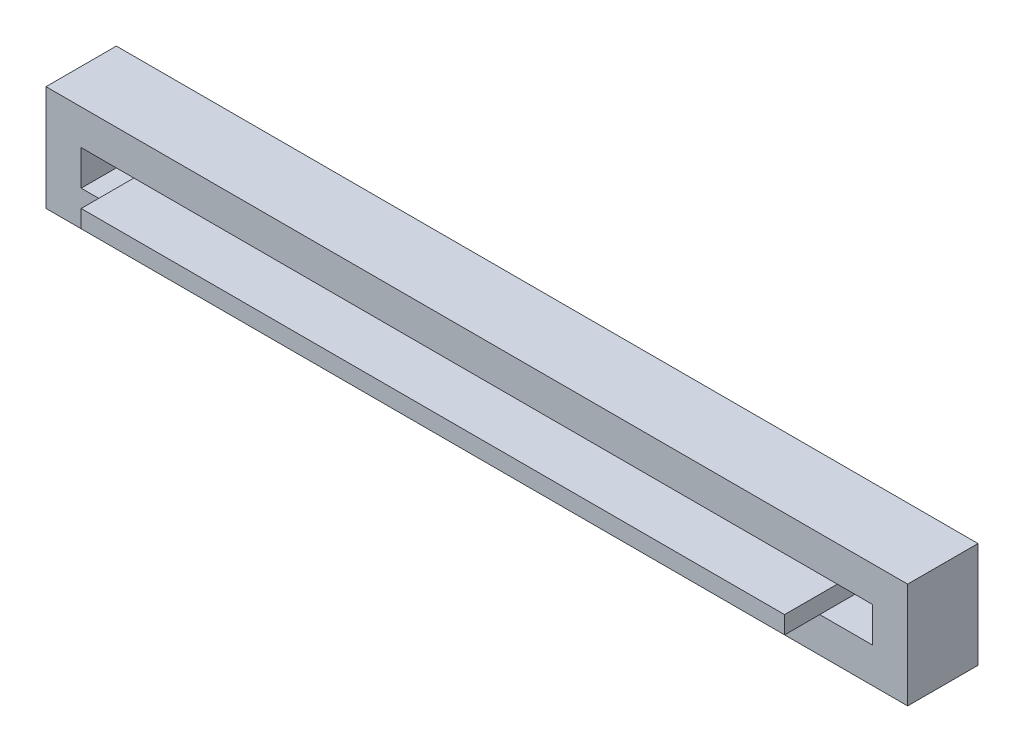
ISO-10303-21;
HEADER;
FILE_DESCRIPTION(('STEP AP214'),'2;1');
FILE_NAME('part.step','',(''),(''),'','','');
FILE_SCHEMA(('AUTOMOTIVE_DESIGN { 1 0 10303 214 1 1 1 1 }'));
ENDSEC;
DATA;
#1=APPLICATION_CONTEXT('core data for automotive mechanical design processes');
#2=APPLICATION_PROTOCOL_DEFINITION('international standard','automotive_design',2000,#1);
#3=PRODUCT_CONTEXT('',#1,'mechanical');
#4=PRODUCT('Part','Part','',(#3));
#5=PRODUCT_RELATED_PRODUCT_CATEGORY('part','',(#4));
#6=PRODUCT_DEFINITION_FORMATION('','',#4);
#7=PRODUCT_DEFINITION_CONTEXT('part definition',#1,'design');
#8=PRODUCT_DEFINITION('design','',#6,#7);
#9=PRODUCT_DEFINITION_SHAPE('','',#8);
#10=(LENGTH_UNIT() NAMED_UNIT(*) SI_UNIT(.MILLI.,.METRE.));
#11=(NAMED_UNIT(*) PLANE_ANGLE_UNIT() SI_UNIT($,.RADIAN.));
#12=(NAMED_UNIT(*) SI_UNIT($,.STERADIAN.) SOLID_ANGLE_UNIT());
#13=UNCERTAINTY_MEASURE_WITH_UNIT(LENGTH_MEASURE(1.E-05),#10,'distance_accuracy_value','');
#14=(GEOMETRIC_REPRESENTATION_CONTEXT(3) GLOBAL_UNCERTAINTY_ASSIGNED_CONTEXT((#13)) GLOBAL_UNIT_ASSIGNED_CONTEXT((#10,
#11,#12)) REPRESENTATION_CONTEXT('',''));
#15=CARTESIAN_POINT('',(0.,0.,0.));
#16=DIRECTION('',(0.,0.,1.));
#17=DIRECTION('',(1.,0.,0.));
#18=AXIS2_PLACEMENT_3D('',#15,#16,#17);
#19=CARTESIAN_POINT('',(0.,0.,2.));
#20=DIRECTION('',(0.,0.,1.));
#21=DIRECTION('',(1.,0.,0.));
#22=AXIS2_PLACEMENT_3D('',#19,#20,#21);
#23=PLANE('',#22);
#24=DIRECTION('',(0.,-1.,0.));
#25=VECTOR('',#24,1.);
#26=CARTESIAN_POINT('',(22.5,0.,2.));
#27=LINE('',#26,#25);
#28=CARTESIAN_POINT('',(22.5,0.999999999999999,2.));
#29=VERTEX_POINT('',#28);
#30=CARTESIAN_POINT('',(22.5,-0.999999999999999,2.));
#31=VERTEX_POINT('',#30);
#32=EDGE_CURVE('E239',#29,#31,#27,.T.);
#33=ORIENTED_EDGE('',*,*,#32,.F.);
#34=DIRECTION('',(1.,0.,0.));
#35=VECTOR('',#34,1.);
#36=CARTESIAN_POINT('',(0.,0.999999999999999,2.));
#37=LINE('',#36,#35);
#38=CARTESIAN_POINT('',(-22.5,0.999999999999999,2.));
#39=VERTEX_POINT('',#38);
#40=EDGE_CURVE('E242',#39,#29,#37,.T.);
#41=ORIENTED_EDGE('',*,*,#40,.F.);
#42=DIRECTION('',(0.,-1.,0.));
#43=VECTOR('',#42,1.);
#44=CARTESIAN_POINT('',(-22.5,0.,2.));
#45=LINE('',#44,#43);
#46=CARTESIAN_POINT('',(-22.5,-0.999999999999999,2.));
#47=VERTEX_POINT('',#46);
#48=EDGE_CURVE('E56',#39,#47,#45,.T.);
#49=ORIENTED_EDGE('',*,*,#48,.T.);
#50=DIRECTION('',(1.,0.,0.));
#51=VECTOR('',#50,1.);
#52=CARTESIAN_POINT('',(0.,-0.999999999999999,2.));
#53=LINE('',#52,#51);
#54=EDGE_CURVE('E11',#47,#31,#53,.T.);
#55=ORIENTED_EDGE('',*,*,#54,.T.);
#56=EDGE_LOOP('',(#33,#41,#49,#55));
#57=FACE_BOUND('',#56,.T.);
#58=DIRECTION('',(-1.,0.,0.));
#59=VECTOR('',#58,1.);
#60=CARTESIAN_POINT('',(-20.,0.5,2.));
#61=LINE('',#60,#59);
#62=CARTESIAN_POINT('',(20.,0.5,2.));
#63=VERTEX_POINT('',#62);
#64=CARTESIAN_POINT('',(-20.,0.5,2.));
#65=VERTEX_POINT('',#64);
#66=EDGE_CURVE('E425',#63,#65,#61,.T.);
#67=ORIENTED_EDGE('',*,*,#66,.F.);
#68=DIRECTION('',(0.,1.,0.));
#69=VECTOR('',#68,1.);
#70=CARTESIAN_POINT('',(20.,0.5,2.));
#71=LINE('',#70,#69);
#72=CARTESIAN_POINT('',(20.,-0.5,2.));
#73=VERTEX_POINT('',#72);
#74=EDGE_CURVE('E162',#73,#63,#71,.T.);
#75=ORIENTED_EDGE('',*,*,#74,.F.);
#76=DIRECTION('',(1.,0.,0.));
#77=VECTOR('',#76,1.);
#78=CARTESIAN_POINT('',(-20.,-0.5,2.));
#79=LINE('',#78,#77);
#80=CARTESIAN_POINT('',(-20.,-0.5,2.));
#81=VERTEX_POINT('',#80);
#82=EDGE_CURVE('E158',#81,#73,#79,.T.);
#83=ORIENTED_EDGE('',*,*,#82,.F.);
#84=DIRECTION('',(0.,-1.,0.));
#85=VECTOR('',#84,1.);
#86=CARTESIAN_POINT('',(-20.,0.5,2.));
#87=LINE('',#86,#85);
#88=EDGE_CURVE('E421',#65,#81,#87,.T.);
#89=ORIENTED_EDGE('',*,*,#88,.F.);
#90=EDGE_LOOP('',(#67,#75,#83,#89));
#91=FACE_BOUND('',#90,.T.);
#92=ADVANCED_FACE('F47',(#57,#91),#23,.T.);
#93=CARTESIAN_POINT('',(0.,0.,4.));
#94=DIRECTION('',(0.,0.,1.));
#95=DIRECTION('',(1.,0.,0.));
#96=AXIS2_PLACEMENT_3D('',#93,#94,#95);
#97=PLANE('',#96);
#98=DIRECTION('',(0.,1.,0.));
#99=VECTOR('',#98,1.);
#100=CARTESIAN_POINT('',(24.5,3.,4.));
#101=LINE('',#100,#99);
#102=CARTESIAN_POINT('',(24.5,-3.,4.));
#103=VERTEX_POINT('',#102);
#104=CARTESIAN_POINT('',(24.5,3.,4.));
#105=VERTEX_POINT('',#104);
#106=EDGE_CURVE('E198',#103,#105,#101,.T.);
#107=ORIENTED_EDGE('',*,*,#106,.T.);
#108=DIRECTION('',(-1.,0.,0.));
#109=VECTOR('',#108,1.);
#110=CARTESIAN_POINT('',(-24.5,3.,4.));
#111=LINE('',#110,#109);
#112=CARTESIAN_POINT('',(-24.5,3.,4.));
#113=VERTEX_POINT('',#112);
#114=EDGE_CURVE('E202',#105,#113,#111,.T.);
#115=ORIENTED_EDGE('',*,*,#114,.T.);
#116=DIRECTION('',(0.,-1.,0.));
#117=VECTOR('',#116,1.);
#118=CARTESIAN_POINT('',(-24.5,3.,4.));
#119=LINE('',#118,#117);
#120=CARTESIAN_POINT('',(-24.5,-3.,4.));
#121=VERTEX_POINT('',#120);
#122=EDGE_CURVE('E206',#113,#121,#119,.T.);
#123=ORIENTED_EDGE('',*,*,#122,.T.);
#124=DIRECTION('',(1.,0.,0.));
#125=VECTOR('',#124,1.);
#126=CARTESIAN_POINT('',(-24.5,-3.,4.));
#127=LINE('',#126,#125);
#128=EDGE_CURVE('E209',#121,#103,#127,.T.);
#129=ORIENTED_EDGE('',*,*,#128,.T.);
#130=EDGE_LOOP('',(#107,#115,#123,#129));
#131=FACE_BOUND('',#130,.T.);
#132=DIRECTION('',(-1.,0.,0.));
#133=VECTOR('',#132,1.);
#134=CARTESIAN_POINT('',(-22.5,0.999999999999999,4.));
#135=LINE('',#134,#133);
#136=CARTESIAN_POINT('',(22.5,0.999999999999999,4.));
#137=VERTEX_POINT('',#136);
#138=CARTESIAN_POINT('',(-22.5,0.999999999999999,4.));
#139=VERTEX_POINT('',#138);
#140=EDGE_CURVE('E169',#137,#139,#135,.T.);
#141=ORIENTED_EDGE('',*,*,#140,.F.);
#142=DIRECTION('',(0.,1.,0.));
#143=VECTOR('',#142,1.);
#144=CARTESIAN_POINT('',(22.5,0.999999999999999,4.));
#145=LINE('',#144,#143);
#146=CARTESIAN_POINT('',(22.5,-0.999999999999999,4.));
#147=VERTEX_POINT('',#146);
#148=EDGE_CURVE('E165',#147,#137,#145,.T.);
#149=ORIENTED_EDGE('',*,*,#148,.F.);
#150=DIRECTION('',(1.,0.,0.));
#151=VECTOR('',#150,1.);
#152=CARTESIAN_POINT('',(-22.5,-0.999999999999999,4.));
#153=LINE('',#152,#151);
#154=CARTESIAN_POINT('',(-22.5,-0.999999999999999,4.));
#155=VERTEX_POINT('',#154);
#156=EDGE_CURVE('E180',#155,#147,#153,.T.);
#157=ORIENTED_EDGE('',*,*,#156,.F.);
#158=DIRECTION('',(0.,-1.,0.));
#159=VECTOR('',#158,1.);
#160=CARTESIAN_POINT('',(-22.5,0.999999999999999,4.));
#161=LINE('',#160,#159);
#162=EDGE_CURVE('E176',#139,#155,#161,.T.);
#163=ORIENTED_EDGE('',*,*,#162,.F.);
#164=EDGE_LOOP('',(#141,#149,#157,#163));
#165=FACE_BOUND('',#164,.T.);
#166=ADVANCED_FACE('F260',(#131,#165),#97,.T.);
#167=CARTESIAN_POINT('',(24.5,3.,4.));
#168=DIRECTION('',(-1.,0.,0.));
#169=DIRECTION('',(0.,0.,1.));
#170=AXIS2_PLACEMENT_3D('',#167,#168,#169);
#171=PLANE('',#170);
#172=DIRECTION('',(0.,1.,0.));
#173=VECTOR('',#172,1.);
#174=CARTESIAN_POINT('',(24.5,3.,0.));
#175=LINE('',#174,#173);
#176=CARTESIAN_POINT('',(24.5,-3.,0.));
#177=VERTEX_POINT('',#176);
#178=CARTESIAN_POINT('',(24.5,3.,0.));
#179=VERTEX_POINT('',#178);
#180=EDGE_CURVE('E197',#177,#179,#175,.T.);
#181=ORIENTED_EDGE('',*,*,#180,.T.);
#182=DIRECTION('',(0.,0.,-1.));
#183=VECTOR('',#182,1.);
#184=CARTESIAN_POINT('',(24.5,3.,4.));
#185=LINE('',#184,#183);
#186=EDGE_CURVE('E235',#105,#179,#185,.T.);
#187=ORIENTED_EDGE('',*,*,#186,.F.);
#188=ORIENTED_EDGE('',*,*,#106,.F.);
#189=DIRECTION('',(0.,0.,-1.));
#190=VECTOR('',#189,1.);
#191=CARTESIAN_POINT('',(24.5,-3.,4.));
#192=LINE('',#191,#190);
#193=EDGE_CURVE('E212',#103,#177,#192,.T.);
#194=ORIENTED_EDGE('',*,*,#193,.T.);
#195=EDGE_LOOP('',(#181,#187,#188,#194));
#196=FACE_BOUND('',#195,.T.);
#197=ADVANCED_FACE('F283',(#196),#171,.F.);
#198=CARTESIAN_POINT('',(-24.5,3.,4.));
#199=DIRECTION('',(0.,-1.,0.));
#200=DIRECTION('',(0.,0.,-1.));
#201=AXIS2_PLACEMENT_3D('',#198,#199,#200);
#202=PLANE('',#201);
#203=DIRECTION('',(-1.,0.,0.));
#204=VECTOR('',#203,1.);
#205=CARTESIAN_POINT('',(-24.5,3.,0.));
#206=LINE('',#205,#204);
#207=CARTESIAN_POINT('',(-24.5,3.,0.));
#208=VERTEX_POINT('',#207);
#209=EDGE_CURVE('E216',#179,#208,#206,.T.);
#210=ORIENTED_EDGE('',*,*,#209,.T.);
#211=DIRECTION('',(0.,0.,-1.));
#212=VECTOR('',#211,1.);
#213=CARTESIAN_POINT('',(-24.5,3.,4.));
#214=LINE('',#213,#212);
#215=EDGE_CURVE('E231',#113,#208,#214,.T.);
#216=ORIENTED_EDGE('',*,*,#215,.F.);
#217=ORIENTED_EDGE('',*,*,#114,.F.);
#218=ORIENTED_EDGE('',*,*,#186,.T.);
#219=EDGE_LOOP('',(#210,#216,#217,#218));
#220=FACE_BOUND('',#219,.T.);
#221=ADVANCED_FACE('F288',(#220),#202,.F.);
#222=CARTESIAN_POINT('',(-24.5,3.,4.));
#223=DIRECTION('',(1.,0.,0.));
#224=DIRECTION('',(0.,0.,-1.));
#225=AXIS2_PLACEMENT_3D('',#222,#223,#224);
#226=PLANE('',#225);
#227=DIRECTION('',(0.,-1.,0.));
#228=VECTOR('',#227,1.);
#229=CARTESIAN_POINT('',(-24.5,3.,0.));
#230=LINE('',#229,#228);
#231=CARTESIAN_POINT('',(-24.5,-3.,0.));
#232=VERTEX_POINT('',#231);
#233=EDGE_CURVE('E219',#208,#232,#230,.T.);
#234=ORIENTED_EDGE('',*,*,#233,.T.);
#235=DIRECTION('',(0.,0.,-1.));
#236=VECTOR('',#235,1.);
#237=CARTESIAN_POINT('',(-24.5,-3.,4.));
#238=LINE('',#237,#236);
#239=EDGE_CURVE('E227',#121,#232,#238,.T.);
#240=ORIENTED_EDGE('',*,*,#239,.F.);
#241=ORIENTED_EDGE('',*,*,#122,.F.);
#242=ORIENTED_EDGE('',*,*,#215,.T.);
#243=EDGE_LOOP('',(#234,#240,#241,#242));
#244=FACE_BOUND('',#243,.T.);
#245=ADVANCED_FACE('F273',(#244),#226,.F.);
#246=CARTESIAN_POINT('',(-24.5,-3.,4.));
#247=DIRECTION('',(0.,1.,0.));
#248=DIRECTION('',(0.,0.,1.));
#249=AXIS2_PLACEMENT_3D('',#246,#247,#248);
#250=PLANE('',#249);
#251=DIRECTION('',(1.,0.,0.));
#252=VECTOR('',#251,1.);
#253=CARTESIAN_POINT('',(-24.5,-3.,0.));
#254=LINE('',#253,#252);
#255=EDGE_CURVE('E203',#232,#177,#254,.T.);
#256=ORIENTED_EDGE('',*,*,#255,.T.);
#257=ORIENTED_EDGE('',*,*,#193,.F.);
#258=ORIENTED_EDGE('',*,*,#128,.F.);
#259=ORIENTED_EDGE('',*,*,#239,.T.);
#260=EDGE_LOOP('',(#256,#257,#258,#259));
#261=FACE_BOUND('',#260,.T.);
#262=ADVANCED_FACE('F266',(#261),#250,.F.);
#263=CARTESIAN_POINT('',(22.5,0.999999999999999,4.));
#264=DIRECTION('',(-1.,0.,0.));
#265=DIRECTION('',(0.,-1.,0.));
#266=AXIS2_PLACEMENT_3D('',#263,#264,#265);
#267=PLANE('',#266);
#268=DIRECTION('',(0.,0.,-1.));
#269=VECTOR('',#268,1.);
#270=CARTESIAN_POINT('',(22.5,0.999999999999999,4.));
#271=LINE('',#270,#269);
#272=EDGE_CURVE('E193',#137,#29,#271,.T.);
#273=ORIENTED_EDGE('',*,*,#272,.T.);
#274=ORIENTED_EDGE('',*,*,#32,.T.);
#275=DIRECTION('',(0.,0.,-1.));
#276=VECTOR('',#275,1.);
#277=CARTESIAN_POINT('',(22.5,-0.999999999999999,4.));
#278=LINE('',#277,#276);
#279=EDGE_CURVE('E71',#147,#31,#278,.T.);
#280=ORIENTED_EDGE('',*,*,#279,.F.);
#281=ORIENTED_EDGE('',*,*,#148,.T.);
#282=EDGE_LOOP('',(#273,#274,#280,#281));
#283=FACE_BOUND('',#282,.T.);
#284=ADVANCED_FACE('F264',(#283),#267,.T.);
#285=CARTESIAN_POINT('',(-22.5,0.999999999999999,4.));
#286=DIRECTION('',(0.,-1.,0.));
#287=DIRECTION('',(0.,0.,-1.));
#288=AXIS2_PLACEMENT_3D('',#285,#286,#287);
#289=PLANE('',#288);
#290=DIRECTION('',(0.,0.,-1.));
#291=VECTOR('',#290,1.);
#292=CARTESIAN_POINT('',(-22.5,0.999999999999999,4.));
#293=LINE('',#292,#291);
#294=EDGE_CURVE('E189',#139,#39,#293,.T.);
#295=ORIENTED_EDGE('',*,*,#294,.T.);
#296=ORIENTED_EDGE('',*,*,#40,.T.);
#297=ORIENTED_EDGE('',*,*,#272,.F.);
#298=ORIENTED_EDGE('',*,*,#140,.T.);
#299=EDGE_LOOP('',(#295,#296,#297,#298));
#300=FACE_BOUND('',#299,.T.);
#301=ADVANCED_FACE('F255',(#300),#289,.T.);
#302=CARTESIAN_POINT('',(-22.5,0.999999999999999,4.));
#303=DIRECTION('',(1.,0.,0.));
#304=DIRECTION('',(0.,0.,-1.));
#305=AXIS2_PLACEMENT_3D('',#302,#303,#304);
#306=PLANE('',#305);
#307=DIRECTION('',(0.,0.,-1.));
#308=VECTOR('',#307,1.);
#309=CARTESIAN_POINT('',(-22.5,-0.999999999999999,4.));
#310=LINE('',#309,#308);
#311=EDGE_CURVE('E185',#155,#47,#310,.T.);
#312=ORIENTED_EDGE('',*,*,#311,.T.);
#313=ORIENTED_EDGE('',*,*,#48,.F.);
#314=ORIENTED_EDGE('',*,*,#294,.F.);
#315=ORIENTED_EDGE('',*,*,#162,.T.);
#316=EDGE_LOOP('',(#312,#313,#314,#315));
#317=FACE_BOUND('',#316,.T.);
#318=ADVANCED_FACE('F252',(#317),#306,.T.);
#319=CARTESIAN_POINT('',(-22.5,-0.999999999999999,4.));
#320=DIRECTION('',(0.,1.,0.));
#321=DIRECTION('',(0.,0.,1.));
#322=AXIS2_PLACEMENT_3D('',#319,#320,#321);
#323=PLANE('',#322);
#324=ORIENTED_EDGE('',*,*,#279,.T.);
#325=ORIENTED_EDGE('',*,*,#54,.F.);
#326=ORIENTED_EDGE('',*,*,#311,.F.);
#327=ORIENTED_EDGE('',*,*,#156,.T.);
#328=EDGE_LOOP('',(#324,#325,#326,#327));
#329=FACE_BOUND('',#328,.T.);
#330=ADVANCED_FACE('F262',(#329),#323,.T.);
#331=CARTESIAN_POINT('',(0.,0.,0.));
#332=DIRECTION('',(0.,0.,1.));
#333=DIRECTION('',(1.,0.,0.));
#334=AXIS2_PLACEMENT_3D('',#331,#332,#333);
#335=PLANE('',#334);
#336=ORIENTED_EDGE('',*,*,#180,.F.);
#337=ORIENTED_EDGE('',*,*,#255,.F.);
#338=ORIENTED_EDGE('',*,*,#233,.F.);
#339=ORIENTED_EDGE('',*,*,#209,.F.);
#340=EDGE_LOOP('',(#336,#337,#338,#339));
#341=FACE_BOUND('',#340,.T.);
#342=ADVANCED_FACE('F49',(#341),#335,.F.);
#343=CARTESIAN_POINT('',(20.,0.5,6.5));
#344=DIRECTION('',(-1.,0.,0.));
#345=DIRECTION('',(0.,0.,1.));
#346=AXIS2_PLACEMENT_3D('',#343,#344,#345);
#347=PLANE('',#346);
#348=ORIENTED_EDGE('',*,*,#74,.T.);
#349=DIRECTION('',(0.,0.,-1.));
#350=VECTOR('',#349,1.);
#351=CARTESIAN_POINT('',(20.,0.5,6.5));
#352=LINE('',#351,#350);
#353=CARTESIAN_POINT('',(20.,0.5,6.5));
#354=VERTEX_POINT('',#353);
#355=EDGE_CURVE('E141',#354,#63,#352,.T.);
#356=ORIENTED_EDGE('',*,*,#355,.F.);
#357=DIRECTION('',(0.,1.,0.));
#358=VECTOR('',#357,1.);
#359=CARTESIAN_POINT('',(20.,0.5,6.5));
#360=LINE('',#359,#358);
#361=CARTESIAN_POINT('',(20.,-0.5,6.5));
#362=VERTEX_POINT('',#361);
#363=EDGE_CURVE('E149',#362,#354,#360,.T.);
#364=ORIENTED_EDGE('',*,*,#363,.F.);
#365=DIRECTION('',(0.,0.,-1.));
#366=VECTOR('',#365,1.);
#367=CARTESIAN_POINT('',(20.,-0.5,6.5));
#368=LINE('',#367,#366);
#369=EDGE_CURVE('E418',#362,#73,#368,.T.);
#370=ORIENTED_EDGE('',*,*,#369,.T.);
#371=EDGE_LOOP('',(#348,#356,#364,#370));
#372=FACE_BOUND('',#371,.T.);
#373=ADVANCED_FACE('F160',(#372),#347,.F.);
#374=CARTESIAN_POINT('',(-20.,0.5,6.5));
#375=DIRECTION('',(0.,-1.,0.));
#376=DIRECTION('',(0.,0.,-1.));
#377=AXIS2_PLACEMENT_3D('',#374,#375,#376);
#378=PLANE('',#377);
#379=ORIENTED_EDGE('',*,*,#66,.T.);
#380=DIRECTION('',(0.,0.,-1.));
#381=VECTOR('',#380,1.);
#382=CARTESIAN_POINT('',(-20.,0.5,6.5));
#383=LINE('',#382,#381);
#384=CARTESIAN_POINT('',(-20.,0.5,6.5));
#385=VERTEX_POINT('',#384);
#386=EDGE_CURVE('E144',#385,#65,#383,.T.);
#387=ORIENTED_EDGE('',*,*,#386,.F.);
#388=DIRECTION('',(-1.,0.,0.));
#389=VECTOR('',#388,1.);
#390=CARTESIAN_POINT('',(-20.,0.5,6.5));
#391=LINE('',#390,#389);
#392=EDGE_CURVE('E137',#354,#385,#391,.T.);
#393=ORIENTED_EDGE('',*,*,#392,.F.);
#394=ORIENTED_EDGE('',*,*,#355,.T.);
#395=EDGE_LOOP('',(#379,#387,#393,#394));
#396=FACE_BOUND('',#395,.T.);
#397=ADVANCED_FACE('F139',(#396),#378,.F.);
#398=CARTESIAN_POINT('',(-20.,0.5,6.5));
#399=DIRECTION('',(1.,0.,0.));
#400=DIRECTION('',(0.,0.,-1.));
#401=AXIS2_PLACEMENT_3D('',#398,#399,#400);
#402=PLANE('',#401);
#403=ORIENTED_EDGE('',*,*,#88,.T.);
#404=DIRECTION('',(0.,0.,-1.));
#405=VECTOR('',#404,1.);
#406=CARTESIAN_POINT('',(-20.,-0.5,6.5));
#407=LINE('',#406,#405);
#408=CARTESIAN_POINT('',(-20.,-0.5,6.5));
#409=VERTEX_POINT('',#408);
#410=EDGE_CURVE('E63',#409,#81,#407,.T.);
#411=ORIENTED_EDGE('',*,*,#410,.F.);
#412=DIRECTION('',(0.,-1.,0.));
#413=VECTOR('',#412,1.);
#414=CARTESIAN_POINT('',(-20.,0.5,6.5));
#415=LINE('',#414,#413);
#416=EDGE_CURVE('E148',#385,#409,#415,.T.);
#417=ORIENTED_EDGE('',*,*,#416,.F.);
#418=ORIENTED_EDGE('',*,*,#386,.T.);
#419=EDGE_LOOP('',(#403,#411,#417,#418));
#420=FACE_BOUND('',#419,.T.);
#421=ADVANCED_FACE('F320',(#420),#402,.F.);
#422=CARTESIAN_POINT('',(-20.,-0.5,6.5));
#423=DIRECTION('',(0.,1.,0.));
#424=DIRECTION('',(0.,0.,1.));
#425=AXIS2_PLACEMENT_3D('',#422,#423,#424);
#426=PLANE('',#425);
#427=ORIENTED_EDGE('',*,*,#82,.T.);
#428=ORIENTED_EDGE('',*,*,#369,.F.);
#429=DIRECTION('',(1.,0.,0.));
#430=VECTOR('',#429,1.);
#431=CARTESIAN_POINT('',(-20.,-0.5,6.5));
#432=LINE('',#431,#430);
#433=EDGE_CURVE('E153',#409,#362,#432,.T.);
#434=ORIENTED_EDGE('',*,*,#433,.F.);
#435=ORIENTED_EDGE('',*,*,#410,.T.);
#436=EDGE_LOOP('',(#427,#428,#434,#435));
#437=FACE_BOUND('',#436,.T.);
#438=ADVANCED_FACE('F323',(#437),#426,.F.);
#439=CARTESIAN_POINT('',(0.,0.,6.5));
#440=DIRECTION('',(0.,0.,1.));
#441=DIRECTION('',(1.,0.,0.));
#442=AXIS2_PLACEMENT_3D('',#439,#440,#441);
#443=PLANE('',#442);
#444=ORIENTED_EDGE('',*,*,#363,.T.);
#445=ORIENTED_EDGE('',*,*,#392,.T.);
#446=ORIENTED_EDGE('',*,*,#416,.T.);
#447=ORIENTED_EDGE('',*,*,#433,.T.);
#448=EDGE_LOOP('',(#444,#445,#446,#447));
#449=FACE_BOUND('',#448,.T.);
#450=ADVANCED_FACE('F152',(#449),#443,.T.);
#451=CLOSED_SHELL('',(#92,#166,#197,#221,#245,#262,#284,#301,#318,#330,#342,#373,#397,#421,#438,#450));
#452=MANIFOLD_SOLID_BREP('B2',#451);
#453=ADVANCED_BREP_SHAPE_REPRESENTATION('',(#18,#452),#14);
#454=SHAPE_DEFINITION_REPRESENTATION(#9,#453);
ENDSEC;
END-ISO-10303-21;
